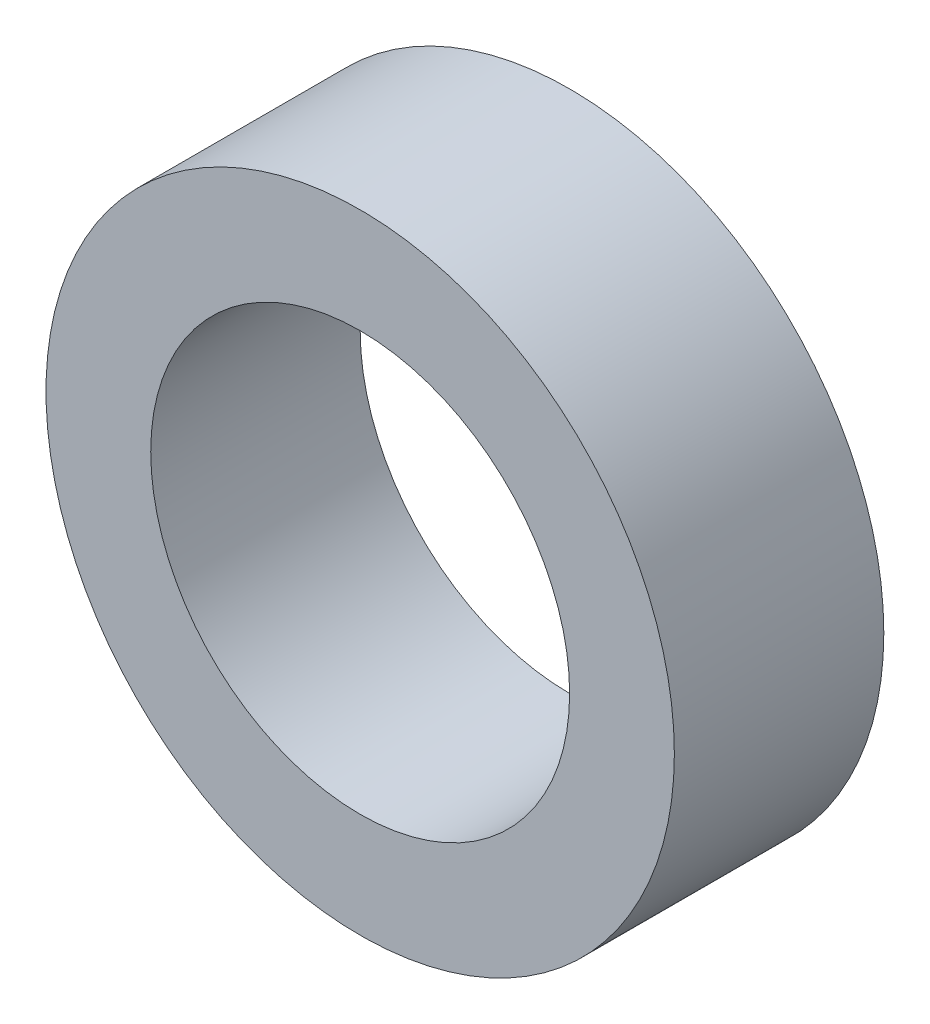
ISO-10303-21;
HEADER;
FILE_DESCRIPTION(('STEP AP214'),'2;1');
FILE_NAME('part.step','',(''),(''),'','','');
FILE_SCHEMA(('AUTOMOTIVE_DESIGN { 1 0 10303 214 1 1 1 1 }'));
ENDSEC;
DATA;
#1=APPLICATION_CONTEXT('core data for automotive mechanical design processes');
#2=APPLICATION_PROTOCOL_DEFINITION('international standard','automotive_design',2000,#1);
#3=PRODUCT_CONTEXT('',#1,'mechanical');
#4=PRODUCT('Part','Part','',(#3));
#5=PRODUCT_RELATED_PRODUCT_CATEGORY('part','',(#4));
#6=PRODUCT_DEFINITION_FORMATION('','',#4);
#7=PRODUCT_DEFINITION_CONTEXT('part definition',#1,'design');
#8=PRODUCT_DEFINITION('design','',#6,#7);
#9=PRODUCT_DEFINITION_SHAPE('','',#8);
#10=(LENGTH_UNIT() NAMED_UNIT(*) SI_UNIT(.MILLI.,.METRE.));
#11=(NAMED_UNIT(*) PLANE_ANGLE_UNIT() SI_UNIT($,.RADIAN.));
#12=(NAMED_UNIT(*) SI_UNIT($,.STERADIAN.) SOLID_ANGLE_UNIT());
#13=UNCERTAINTY_MEASURE_WITH_UNIT(LENGTH_MEASURE(1.E-05),#10,'distance_accuracy_value','');
#14=(GEOMETRIC_REPRESENTATION_CONTEXT(3) GLOBAL_UNCERTAINTY_ASSIGNED_CONTEXT((#13)) GLOBAL_UNIT_ASSIGNED_CONTEXT((#10,
#11,#12)) REPRESENTATION_CONTEXT('',''));
#15=CARTESIAN_POINT('',(0.,0.,0.));
#16=DIRECTION('',(0.,0.,1.));
#17=DIRECTION('',(1.,0.,0.));
#18=AXIS2_PLACEMENT_3D('',#15,#16,#17);
#19=CARTESIAN_POINT('',(0.,0.,5.));
#20=DIRECTION('',(0.,0.,1.));
#21=DIRECTION('',(1.,0.,0.));
#22=AXIS2_PLACEMENT_3D('',#19,#20,#21);
#23=PLANE('',#22);
#24=CARTESIAN_POINT('',(0.,0.,5.));
#25=DIRECTION('',(0.,0.,1.));
#26=DIRECTION('',(1.,0.,0.));
#27=AXIS2_PLACEMENT_3D('',#24,#25,#26);
#28=CIRCLE('',#27,7.5);
#29=CARTESIAN_POINT('',(7.5,0.,5.));
#30=VERTEX_POINT('',#29);
#31=EDGE_CURVE('E10',#30,#30,#28,.T.);
#32=ORIENTED_EDGE('',*,*,#31,.T.);
#33=EDGE_LOOP('',(#32));
#34=FACE_BOUND('',#33,.T.);
#35=CARTESIAN_POINT('',(0.,0.,5.));
#36=DIRECTION('',(0.,0.,1.));
#37=DIRECTION('',(1.,0.,0.));
#38=AXIS2_PLACEMENT_3D('',#35,#36,#37);
#39=CIRCLE('',#38,5.);
#40=CARTESIAN_POINT('',(5.,0.,5.));
#41=VERTEX_POINT('',#40);
#42=EDGE_CURVE('E47',#41,#41,#39,.T.);
#43=ORIENTED_EDGE('',*,*,#42,.F.);
#44=EDGE_LOOP('',(#43));
#45=FACE_BOUND('',#44,.T.);
#46=ADVANCED_FACE('F34',(#34,#45),#23,.T.);
#47=CARTESIAN_POINT('',(0.,0.,0.));
#48=DIRECTION('',(0.,0.,1.));
#49=DIRECTION('',(1.,0.,0.));
#50=AXIS2_PLACEMENT_3D('',#47,#48,#49);
#51=PLANE('',#50);
#52=CARTESIAN_POINT('',(0.,0.,0.));
#53=DIRECTION('',(0.,0.,1.));
#54=DIRECTION('',(1.,0.,0.));
#55=AXIS2_PLACEMENT_3D('',#52,#53,#54);
#56=CIRCLE('',#55,7.5);
#57=CARTESIAN_POINT('',(7.5,0.,0.));
#58=VERTEX_POINT('',#57);
#59=EDGE_CURVE('E38',#58,#58,#56,.T.);
#60=ORIENTED_EDGE('',*,*,#59,.F.);
#61=EDGE_LOOP('',(#60));
#62=FACE_BOUND('',#61,.T.);
#63=CARTESIAN_POINT('',(0.,0.,0.));
#64=DIRECTION('',(0.,0.,1.));
#65=DIRECTION('',(1.,0.,0.));
#66=AXIS2_PLACEMENT_3D('',#63,#64,#65);
#67=CIRCLE('',#66,5.);
#68=CARTESIAN_POINT('',(5.,0.,0.));
#69=VERTEX_POINT('',#68);
#70=EDGE_CURVE('E49',#69,#69,#67,.T.);
#71=ORIENTED_EDGE('',*,*,#70,.T.);
#72=EDGE_LOOP('',(#71));
#73=FACE_BOUND('',#72,.T.);
#74=ADVANCED_FACE('F61',(#62,#73),#51,.F.);
#75=CARTESIAN_POINT('',(0.,0.,5.));
#76=DIRECTION('',(0.,0.,-1.));
#77=DIRECTION('',(-1.,0.,0.));
#78=AXIS2_PLACEMENT_3D('',#75,#76,#77);
#79=CYLINDRICAL_SURFACE('',#78,7.5);
#80=ORIENTED_EDGE('',*,*,#31,.F.);
#81=EDGE_LOOP('',(#80));
#82=FACE_BOUND('',#81,.T.);
#83=ORIENTED_EDGE('',*,*,#59,.T.);
#84=EDGE_LOOP('',(#83));
#85=FACE_BOUND('',#84,.T.);
#86=ADVANCED_FACE('F36',(#82,#85),#79,.T.);
#87=CARTESIAN_POINT('',(0.,0.,5.));
#88=DIRECTION('',(0.,0.,-1.));
#89=DIRECTION('',(-1.,0.,0.));
#90=AXIS2_PLACEMENT_3D('',#87,#88,#89);
#91=CYLINDRICAL_SURFACE('',#90,5.);
#92=ORIENTED_EDGE('',*,*,#42,.T.);
#93=EDGE_LOOP('',(#92));
#94=FACE_BOUND('',#93,.T.);
#95=ORIENTED_EDGE('',*,*,#70,.F.);
#96=EDGE_LOOP('',(#95));
#97=FACE_BOUND('',#96,.T.);
#98=ADVANCED_FACE('F57',(#94,#97),#91,.F.);
#99=CLOSED_SHELL('',(#46,#74,#86,#98));
#100=MANIFOLD_SOLID_BREP('B2',#99);
#101=ADVANCED_BREP_SHAPE_REPRESENTATION('',(#18,#100),#14);
#102=SHAPE_DEFINITION_REPRESENTATION(#9,#101);
ENDSEC;
END-ISO-10303-21;
